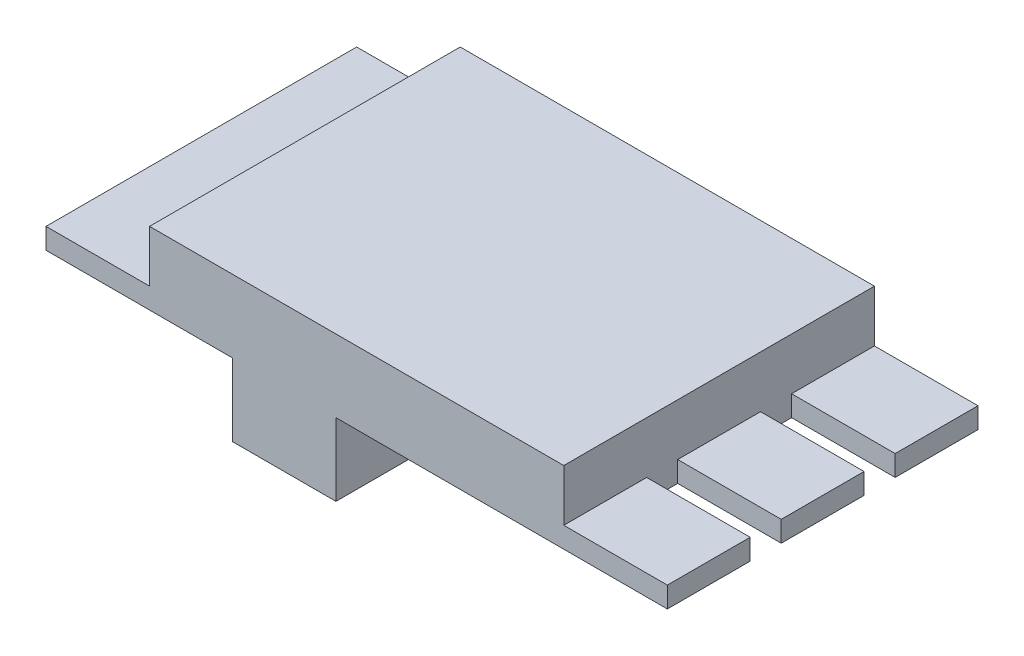
ISO-10303-21;
HEADER;
FILE_DESCRIPTION(('STEP AP214'),'2;1');
FILE_NAME('part.step','',(''),(''),'','','');
FILE_SCHEMA(('AUTOMOTIVE_DESIGN { 1 0 10303 214 1 1 1 1 }'));
ENDSEC;
DATA;
#1=APPLICATION_CONTEXT('core data for automotive mechanical design processes');
#2=APPLICATION_PROTOCOL_DEFINITION('international standard','automotive_design',2000,#1);
#3=PRODUCT_CONTEXT('',#1,'mechanical');
#4=PRODUCT('Part','Part','',(#3));
#5=PRODUCT_RELATED_PRODUCT_CATEGORY('part','',(#4));
#6=PRODUCT_DEFINITION_FORMATION('','',#4);
#7=PRODUCT_DEFINITION_CONTEXT('part definition',#1,'design');
#8=PRODUCT_DEFINITION('design','',#6,#7);
#9=PRODUCT_DEFINITION_SHAPE('','',#8);
#10=(LENGTH_UNIT() NAMED_UNIT(*) SI_UNIT(.MILLI.,.METRE.));
#11=(NAMED_UNIT(*) PLANE_ANGLE_UNIT() SI_UNIT($,.RADIAN.));
#12=(NAMED_UNIT(*) SI_UNIT($,.STERADIAN.) SOLID_ANGLE_UNIT());
#13=UNCERTAINTY_MEASURE_WITH_UNIT(LENGTH_MEASURE(1.E-05),#10,'distance_accuracy_value','');
#14=(GEOMETRIC_REPRESENTATION_CONTEXT(3) GLOBAL_UNCERTAINTY_ASSIGNED_CONTEXT((#13)) GLOBAL_UNIT_ASSIGNED_CONTEXT((#10,
#11,#12)) REPRESENTATION_CONTEXT('',''));
#15=CARTESIAN_POINT('',(0.,0.,0.));
#16=DIRECTION('',(0.,0.,1.));
#17=DIRECTION('',(1.,0.,0.));
#18=AXIS2_PLACEMENT_3D('',#15,#16,#17);
#19=CARTESIAN_POINT('',(15.,7.,7.5));
#20=DIRECTION('',(-1.,0.,0.));
#21=DIRECTION('',(0.,0.,1.));
#22=AXIS2_PLACEMENT_3D('',#19,#20,#21);
#23=PLANE('',#22);
#24=DIRECTION('',(0.,0.,1.));
#25=VECTOR('',#24,1.);
#26=CARTESIAN_POINT('',(15.,3.5,-11.));
#27=LINE('',#26,#25);
#28=CARTESIAN_POINT('',(15.,3.5,-2.));
#29=VERTEX_POINT('',#28);
#30=CARTESIAN_POINT('',(15.,3.5,2.));
#31=VERTEX_POINT('',#30);
#32=EDGE_CURVE('E191',#29,#31,#27,.T.);
#33=ORIENTED_EDGE('',*,*,#32,.F.);
#34=DIRECTION('',(0.,1.,0.));
#35=VECTOR('',#34,1.);
#36=CARTESIAN_POINT('',(15.,-11.5,-2.));
#37=LINE('',#36,#35);
#38=CARTESIAN_POINT('',(15.,4.5,-2.));
#39=VERTEX_POINT('',#38);
#40=EDGE_CURVE('E412',#29,#39,#37,.T.);
#41=ORIENTED_EDGE('',*,*,#40,.T.);
#42=DIRECTION('',(0.,0.,1.));
#43=VECTOR('',#42,1.);
#44=CARTESIAN_POINT('',(15.,4.5,-11.));
#45=LINE('',#44,#43);
#46=CARTESIAN_POINT('',(15.,4.5,2.));
#47=VERTEX_POINT('',#46);
#48=EDGE_CURVE('E193',#39,#47,#45,.T.);
#49=ORIENTED_EDGE('',*,*,#48,.T.);
#50=DIRECTION('',(0.,1.,0.));
#51=VECTOR('',#50,1.);
#52=CARTESIAN_POINT('',(15.,-11.5,2.));
#53=LINE('',#52,#51);
#54=EDGE_CURVE('E55',#31,#47,#53,.T.);
#55=ORIENTED_EDGE('',*,*,#54,.F.);
#56=EDGE_LOOP('',(#33,#41,#49,#55));
#57=FACE_BOUND('',#56,.T.);
#58=ADVANCED_FACE('F39',(#57),#23,.F.);
#59=CARTESIAN_POINT('',(15.,3.5,3.5));
#60=VERTEX_POINT('',#59);
#61=CARTESIAN_POINT('',(15.,3.5,7.5));
#62=VERTEX_POINT('',#61);
#63=EDGE_CURVE('E202',#60,#62,#27,.T.);
#64=ORIENTED_EDGE('',*,*,#63,.F.);
#65=DIRECTION('',(0.,1.,0.));
#66=VECTOR('',#65,1.);
#67=CARTESIAN_POINT('',(15.,-11.5,3.5));
#68=LINE('',#67,#66);
#69=CARTESIAN_POINT('',(15.,4.5,3.5));
#70=VERTEX_POINT('',#69);
#71=EDGE_CURVE('E396',#60,#70,#68,.T.);
#72=ORIENTED_EDGE('',*,*,#71,.T.);
#73=CARTESIAN_POINT('',(15.,4.5,7.5));
#74=VERTEX_POINT('',#73);
#75=EDGE_CURVE('E225',#70,#74,#45,.T.);
#76=ORIENTED_EDGE('',*,*,#75,.T.);
#77=DIRECTION('',(0.,-1.,0.));
#78=VECTOR('',#77,1.);
#79=CARTESIAN_POINT('',(15.,7.,7.5));
#80=LINE('',#79,#78);
#81=EDGE_CURVE('E296',#74,#62,#80,.T.);
#82=ORIENTED_EDGE('',*,*,#81,.T.);
#83=EDGE_LOOP('',(#64,#72,#76,#82));
#84=FACE_BOUND('',#83,.T.);
#85=ADVANCED_FACE('F395',(#84),#23,.F.);
#86=CARTESIAN_POINT('',(10.,4.5,-11.));
#87=DIRECTION('',(0.,-1.,0.));
#88=DIRECTION('',(0.,0.,-1.));
#89=AXIS2_PLACEMENT_3D('',#86,#87,#88);
#90=PLANE('',#89);
#91=ORIENTED_EDGE('',*,*,#48,.F.);
#92=DIRECTION('',(-1.,0.,0.));
#93=VECTOR('',#92,1.);
#94=CARTESIAN_POINT('',(10.,4.5,-2.));
#95=LINE('',#94,#93);
#96=CARTESIAN_POINT('',(10.,4.5,-2.));
#97=VERTEX_POINT('',#96);
#98=EDGE_CURVE('E426',#39,#97,#95,.T.);
#99=ORIENTED_EDGE('',*,*,#98,.T.);
#100=DIRECTION('',(0.,0.,1.));
#101=VECTOR('',#100,1.);
#102=CARTESIAN_POINT('',(10.,4.5,-11.));
#103=LINE('',#102,#101);
#104=CARTESIAN_POINT('',(10.,4.5,2.));
#105=VERTEX_POINT('',#104);
#106=EDGE_CURVE('E230',#97,#105,#103,.T.);
#107=ORIENTED_EDGE('',*,*,#106,.T.);
#108=DIRECTION('',(1.,0.,0.));
#109=VECTOR('',#108,1.);
#110=CARTESIAN_POINT('',(10.,4.5,2.));
#111=LINE('',#110,#109);
#112=EDGE_CURVE('E185',#105,#47,#111,.T.);
#113=ORIENTED_EDGE('',*,*,#112,.T.);
#114=EDGE_LOOP('',(#91,#99,#107,#113));
#115=FACE_BOUND('',#114,.T.);
#116=ADVANCED_FACE('F448',(#115),#90,.F.);
#117=ORIENTED_EDGE('',*,*,#75,.F.);
#118=DIRECTION('',(-1.,0.,0.));
#119=VECTOR('',#118,1.);
#120=CARTESIAN_POINT('',(10.,4.5,3.5));
#121=LINE('',#120,#119);
#122=CARTESIAN_POINT('',(10.,4.5,3.5));
#123=VERTEX_POINT('',#122);
#124=EDGE_CURVE('E184',#70,#123,#121,.T.);
#125=ORIENTED_EDGE('',*,*,#124,.T.);
#126=CARTESIAN_POINT('',(10.,4.5,7.5));
#127=VERTEX_POINT('',#126);
#128=EDGE_CURVE('E231',#123,#127,#103,.T.);
#129=ORIENTED_EDGE('',*,*,#128,.T.);
#130=DIRECTION('',(-1.,0.,0.));
#131=VECTOR('',#130,1.);
#132=CARTESIAN_POINT('',(-15.,4.5,7.5));
#133=LINE('',#132,#131);
#134=EDGE_CURVE('E48',#74,#127,#133,.T.);
#135=ORIENTED_EDGE('',*,*,#134,.F.);
#136=EDGE_LOOP('',(#117,#125,#129,#135));
#137=FACE_BOUND('',#136,.T.);
#138=ADVANCED_FACE('F348',(#137),#90,.F.);
#139=CARTESIAN_POINT('',(15.,4.5,-7.5));
#140=VERTEX_POINT('',#139);
#141=CARTESIAN_POINT('',(15.,4.5,-3.5));
#142=VERTEX_POINT('',#141);
#143=EDGE_CURVE('E221',#140,#142,#45,.T.);
#144=ORIENTED_EDGE('',*,*,#143,.T.);
#145=DIRECTION('',(0.,1.,0.));
#146=VECTOR('',#145,1.);
#147=CARTESIAN_POINT('',(15.,-11.5,-3.5));
#148=LINE('',#147,#146);
#149=CARTESIAN_POINT('',(15.,3.5,-3.5));
#150=VERTEX_POINT('',#149);
#151=EDGE_CURVE('E63',#150,#142,#148,.T.);
#152=ORIENTED_EDGE('',*,*,#151,.F.);
#153=CARTESIAN_POINT('',(15.,3.5,-7.5));
#154=VERTEX_POINT('',#153);
#155=EDGE_CURVE('E201',#154,#150,#27,.T.);
#156=ORIENTED_EDGE('',*,*,#155,.F.);
#157=DIRECTION('',(0.,-1.,0.));
#158=VECTOR('',#157,1.);
#159=CARTESIAN_POINT('',(15.,7.,-7.5));
#160=LINE('',#159,#158);
#161=EDGE_CURVE('E314',#140,#154,#160,.T.);
#162=ORIENTED_EDGE('',*,*,#161,.F.);
#163=EDGE_LOOP('',(#144,#152,#156,#162));
#164=FACE_BOUND('',#163,.T.);
#165=ADVANCED_FACE('F41',(#164),#23,.F.);
#166=CARTESIAN_POINT('',(-15.,7.,-7.5));
#167=DIRECTION('',(0.,0.,1.));
#168=DIRECTION('',(1.,0.,0.));
#169=AXIS2_PLACEMENT_3D('',#166,#167,#168);
#170=PLANE('',#169);
#171=DIRECTION('',(-1.,0.,0.));
#172=VECTOR('',#171,1.);
#173=CARTESIAN_POINT('',(-15.,0.,-7.5));
#174=LINE('',#173,#172);
#175=CARTESIAN_POINT('',(-1.,0.,-7.5));
#176=VERTEX_POINT('',#175);
#177=CARTESIAN_POINT('',(-6.,0.,-7.5));
#178=VERTEX_POINT('',#177);
#179=EDGE_CURVE('E286',#176,#178,#174,.T.);
#180=ORIENTED_EDGE('',*,*,#179,.T.);
#181=DIRECTION('',(0.,1.,0.));
#182=VECTOR('',#181,1.);
#183=CARTESIAN_POINT('',(-6.,7.,-7.5));
#184=LINE('',#183,#182);
#185=CARTESIAN_POINT('',(-6.,3.5,-7.5));
#186=VERTEX_POINT('',#185);
#187=EDGE_CURVE('E250',#178,#186,#184,.T.);
#188=ORIENTED_EDGE('',*,*,#187,.T.);
#189=DIRECTION('',(-1.,0.,0.));
#190=VECTOR('',#189,1.);
#191=CARTESIAN_POINT('',(-15.,3.5,-7.5));
#192=LINE('',#191,#190);
#193=CARTESIAN_POINT('',(-15.,3.5,-7.5));
#194=VERTEX_POINT('',#193);
#195=EDGE_CURVE('E282',#186,#194,#192,.T.);
#196=ORIENTED_EDGE('',*,*,#195,.T.);
#197=DIRECTION('',(0.,-1.,0.));
#198=VECTOR('',#197,1.);
#199=CARTESIAN_POINT('',(-15.,7.,-7.5));
#200=LINE('',#199,#198);
#201=CARTESIAN_POINT('',(-15.,4.5,-7.5));
#202=VERTEX_POINT('',#201);
#203=EDGE_CURVE('E310',#202,#194,#200,.T.);
#204=ORIENTED_EDGE('',*,*,#203,.F.);
#205=DIRECTION('',(1.,0.,0.));
#206=VECTOR('',#205,1.);
#207=CARTESIAN_POINT('',(-15.,4.5,-7.5));
#208=LINE('',#207,#206);
#209=CARTESIAN_POINT('',(-10.,4.5,-7.5));
#210=VERTEX_POINT('',#209);
#211=EDGE_CURVE('E270',#202,#210,#208,.T.);
#212=ORIENTED_EDGE('',*,*,#211,.T.);
#213=DIRECTION('',(0.,1.,0.));
#214=VECTOR('',#213,1.);
#215=CARTESIAN_POINT('',(-10.,7.,-7.5));
#216=LINE('',#215,#214);
#217=CARTESIAN_POINT('',(-10.,7.,-7.5));
#218=VERTEX_POINT('',#217);
#219=EDGE_CURVE('E258',#210,#218,#216,.T.);
#220=ORIENTED_EDGE('',*,*,#219,.T.);
#221=DIRECTION('',(-1.,0.,0.));
#222=VECTOR('',#221,1.);
#223=CARTESIAN_POINT('',(-15.,7.,-7.5));
#224=LINE('',#223,#222);
#225=CARTESIAN_POINT('',(10.,7.,-7.5));
#226=VERTEX_POINT('',#225);
#227=EDGE_CURVE('E287',#226,#218,#224,.T.);
#228=ORIENTED_EDGE('',*,*,#227,.F.);
#229=DIRECTION('',(0.,-1.,0.));
#230=VECTOR('',#229,1.);
#231=CARTESIAN_POINT('',(10.,7.,-7.5));
#232=LINE('',#231,#230);
#233=CARTESIAN_POINT('',(10.,4.5,-7.5));
#234=VERTEX_POINT('',#233);
#235=EDGE_CURVE('E266',#226,#234,#232,.T.);
#236=ORIENTED_EDGE('',*,*,#235,.T.);
#237=DIRECTION('',(1.,0.,0.));
#238=VECTOR('',#237,1.);
#239=CARTESIAN_POINT('',(-15.,4.5,-7.5));
#240=LINE('',#239,#238);
#241=EDGE_CURVE('E278',#234,#140,#240,.T.);
#242=ORIENTED_EDGE('',*,*,#241,.T.);
#243=ORIENTED_EDGE('',*,*,#161,.T.);
#244=DIRECTION('',(-1.,0.,0.));
#245=VECTOR('',#244,1.);
#246=CARTESIAN_POINT('',(-15.,3.5,-7.5));
#247=LINE('',#246,#245);
#248=CARTESIAN_POINT('',(-1.,3.5,-7.5));
#249=VERTEX_POINT('',#248);
#250=EDGE_CURVE('E274',#154,#249,#247,.T.);
#251=ORIENTED_EDGE('',*,*,#250,.T.);
#252=DIRECTION('',(0.,-1.,0.));
#253=VECTOR('',#252,1.);
#254=CARTESIAN_POINT('',(-1.,7.,-7.5));
#255=LINE('',#254,#253);
#256=EDGE_CURVE('E242',#249,#176,#255,.T.);
#257=ORIENTED_EDGE('',*,*,#256,.T.);
#258=EDGE_LOOP('',(#180,#188,#196,#204,#212,#220,#228,#236,#242,#243,#251,#257));
#259=FACE_BOUND('',#258,.T.);
#260=ADVANCED_FACE('F369',(#259),#170,.F.);
#261=CARTESIAN_POINT('',(-15.,7.,7.5));
#262=DIRECTION('',(1.,0.,0.));
#263=DIRECTION('',(0.,0.,-1.));
#264=AXIS2_PLACEMENT_3D('',#261,#262,#263);
#265=PLANE('',#264);
#266=ORIENTED_EDGE('',*,*,#203,.T.);
#267=DIRECTION('',(0.,0.,1.));
#268=VECTOR('',#267,1.);
#269=CARTESIAN_POINT('',(-15.,3.5,-11.));
#270=LINE('',#269,#268);
#271=CARTESIAN_POINT('',(-15.,3.5,7.5));
#272=VERTEX_POINT('',#271);
#273=EDGE_CURVE('E212',#194,#272,#270,.T.);
#274=ORIENTED_EDGE('',*,*,#273,.T.);
#275=DIRECTION('',(0.,-1.,0.));
#276=VECTOR('',#275,1.);
#277=CARTESIAN_POINT('',(-15.,7.,7.5));
#278=LINE('',#277,#276);
#279=CARTESIAN_POINT('',(-15.,4.5,7.5));
#280=VERTEX_POINT('',#279);
#281=EDGE_CURVE('E306',#280,#272,#278,.T.);
#282=ORIENTED_EDGE('',*,*,#281,.F.);
#283=DIRECTION('',(0.,0.,1.));
#284=VECTOR('',#283,1.);
#285=CARTESIAN_POINT('',(-15.,4.5,-11.));
#286=LINE('',#285,#284);
#287=EDGE_CURVE('E216',#202,#280,#286,.T.);
#288=ORIENTED_EDGE('',*,*,#287,.F.);
#289=EDGE_LOOP('',(#266,#274,#282,#288));
#290=FACE_BOUND('',#289,.T.);
#291=ADVANCED_FACE('F371',(#290),#265,.F.);
#292=CARTESIAN_POINT('',(-15.,7.,7.5));
#293=DIRECTION('',(0.,0.,-1.));
#294=DIRECTION('',(-1.,0.,0.));
#295=AXIS2_PLACEMENT_3D('',#292,#293,#294);
#296=PLANE('',#295);
#297=DIRECTION('',(1.,0.,0.));
#298=VECTOR('',#297,1.);
#299=CARTESIAN_POINT('',(-15.,3.5,7.5));
#300=LINE('',#299,#298);
#301=CARTESIAN_POINT('',(-6.,3.5,7.5));
#302=VERTEX_POINT('',#301);
#303=EDGE_CURVE('E11',#272,#302,#300,.T.);
#304=ORIENTED_EDGE('',*,*,#303,.T.);
#305=DIRECTION('',(0.,-1.,0.));
#306=VECTOR('',#305,1.);
#307=CARTESIAN_POINT('',(-6.,7.,7.5));
#308=LINE('',#307,#306);
#309=CARTESIAN_POINT('',(-6.,0.,7.5));
#310=VERTEX_POINT('',#309);
#311=EDGE_CURVE('E246',#302,#310,#308,.T.);
#312=ORIENTED_EDGE('',*,*,#311,.T.);
#313=DIRECTION('',(1.,0.,0.));
#314=VECTOR('',#313,1.);
#315=CARTESIAN_POINT('',(-15.,0.,7.5));
#316=LINE('',#315,#314);
#317=CARTESIAN_POINT('',(-1.,0.,7.5));
#318=VERTEX_POINT('',#317);
#319=EDGE_CURVE('E292',#310,#318,#316,.T.);
#320=ORIENTED_EDGE('',*,*,#319,.T.);
#321=DIRECTION('',(0.,1.,0.));
#322=VECTOR('',#321,1.);
#323=CARTESIAN_POINT('',(-1.,7.,7.5));
#324=LINE('',#323,#322);
#325=CARTESIAN_POINT('',(-1.,3.5,7.5));
#326=VERTEX_POINT('',#325);
#327=EDGE_CURVE('E236',#318,#326,#324,.T.);
#328=ORIENTED_EDGE('',*,*,#327,.T.);
#329=DIRECTION('',(1.,0.,0.));
#330=VECTOR('',#329,1.);
#331=CARTESIAN_POINT('',(-15.,3.5,7.5));
#332=LINE('',#331,#330);
#333=EDGE_CURVE('E335',#326,#62,#332,.T.);
#334=ORIENTED_EDGE('',*,*,#333,.T.);
#335=ORIENTED_EDGE('',*,*,#81,.F.);
#336=ORIENTED_EDGE('',*,*,#134,.T.);
#337=DIRECTION('',(0.,1.,0.));
#338=VECTOR('',#337,1.);
#339=CARTESIAN_POINT('',(10.,7.,7.5));
#340=LINE('',#339,#338);
#341=CARTESIAN_POINT('',(10.,7.,7.5));
#342=VERTEX_POINT('',#341);
#343=EDGE_CURVE('E262',#127,#342,#340,.T.);
#344=ORIENTED_EDGE('',*,*,#343,.T.);
#345=DIRECTION('',(1.,0.,0.));
#346=VECTOR('',#345,1.);
#347=CARTESIAN_POINT('',(-15.,7.,7.5));
#348=LINE('',#347,#346);
#349=CARTESIAN_POINT('',(-10.,7.,7.5));
#350=VERTEX_POINT('',#349);
#351=EDGE_CURVE('E291',#350,#342,#348,.T.);
#352=ORIENTED_EDGE('',*,*,#351,.F.);
#353=DIRECTION('',(0.,-1.,0.));
#354=VECTOR('',#353,1.);
#355=CARTESIAN_POINT('',(-10.,7.,7.5));
#356=LINE('',#355,#354);
#357=CARTESIAN_POINT('',(-10.,4.5,7.5));
#358=VERTEX_POINT('',#357);
#359=EDGE_CURVE('E254',#350,#358,#356,.T.);
#360=ORIENTED_EDGE('',*,*,#359,.T.);
#361=DIRECTION('',(-1.,0.,0.));
#362=VECTOR('',#361,1.);
#363=CARTESIAN_POINT('',(-15.,4.5,7.5));
#364=LINE('',#363,#362);
#365=EDGE_CURVE('E331',#358,#280,#364,.T.);
#366=ORIENTED_EDGE('',*,*,#365,.T.);
#367=ORIENTED_EDGE('',*,*,#281,.T.);
#368=EDGE_LOOP('',(#304,#312,#320,#328,#334,#335,#336,#344,#352,#360,#366,#367));
#369=FACE_BOUND('',#368,.T.);
#370=ADVANCED_FACE('F343',(#369),#296,.F.);
#371=CARTESIAN_POINT('',(0.,7.,0.));
#372=DIRECTION('',(0.,-1.,0.));
#373=DIRECTION('',(0.,0.,-1.));
#374=AXIS2_PLACEMENT_3D('',#371,#372,#373);
#375=PLANE('',#374);
#376=ORIENTED_EDGE('',*,*,#351,.T.);
#377=DIRECTION('',(0.,0.,-1.));
#378=VECTOR('',#377,1.);
#379=CARTESIAN_POINT('',(10.,7.,0.));
#380=LINE('',#379,#378);
#381=EDGE_CURVE('E328',#342,#226,#380,.T.);
#382=ORIENTED_EDGE('',*,*,#381,.T.);
#383=ORIENTED_EDGE('',*,*,#227,.T.);
#384=DIRECTION('',(0.,0.,1.));
#385=VECTOR('',#384,1.);
#386=CARTESIAN_POINT('',(-10.,7.,0.));
#387=LINE('',#386,#385);
#388=EDGE_CURVE('E324',#218,#350,#387,.T.);
#389=ORIENTED_EDGE('',*,*,#388,.T.);
#390=EDGE_LOOP('',(#376,#382,#383,#389));
#391=FACE_BOUND('',#390,.T.);
#392=ADVANCED_FACE('F359',(#391),#375,.F.);
#393=CARTESIAN_POINT('',(0.,0.,0.));
#394=DIRECTION('',(0.,-1.,0.));
#395=DIRECTION('',(0.,0.,-1.));
#396=AXIS2_PLACEMENT_3D('',#393,#394,#395);
#397=PLANE('',#396);
#398=DIRECTION('',(0.,0.,1.));
#399=VECTOR('',#398,1.);
#400=CARTESIAN_POINT('',(-6.,0.,0.));
#401=LINE('',#400,#399);
#402=EDGE_CURVE('E321',#178,#310,#401,.T.);
#403=ORIENTED_EDGE('',*,*,#402,.F.);
#404=ORIENTED_EDGE('',*,*,#179,.F.);
#405=DIRECTION('',(0.,0.,-1.));
#406=VECTOR('',#405,1.);
#407=CARTESIAN_POINT('',(-1.,0.,0.));
#408=LINE('',#407,#406);
#409=EDGE_CURVE('E318',#318,#176,#408,.T.);
#410=ORIENTED_EDGE('',*,*,#409,.F.);
#411=ORIENTED_EDGE('',*,*,#319,.F.);
#412=EDGE_LOOP('',(#403,#404,#410,#411));
#413=FACE_BOUND('',#412,.T.);
#414=ADVANCED_FACE('F382',(#413),#397,.T.);
#415=CARTESIAN_POINT('',(-1.,3.5,-11.));
#416=DIRECTION('',(0.,1.,0.));
#417=DIRECTION('',(0.,0.,1.));
#418=AXIS2_PLACEMENT_3D('',#415,#416,#417);
#419=PLANE('',#418);
#420=DIRECTION('',(0.,0.,1.));
#421=VECTOR('',#420,1.);
#422=CARTESIAN_POINT('',(10.,3.5,-11.));
#423=LINE('',#422,#421);
#424=CARTESIAN_POINT('',(10.,3.5,-3.5));
#425=VERTEX_POINT('',#424);
#426=CARTESIAN_POINT('',(10.,3.5,-2.));
#427=VERTEX_POINT('',#426);
#428=EDGE_CURVE('E208',#425,#427,#423,.T.);
#429=ORIENTED_EDGE('',*,*,#428,.T.);
#430=DIRECTION('',(1.,0.,0.));
#431=VECTOR('',#430,1.);
#432=CARTESIAN_POINT('',(-0.999999999999999,3.5,-2.));
#433=LINE('',#432,#431);
#434=EDGE_CURVE('E199',#427,#29,#433,.T.);
#435=ORIENTED_EDGE('',*,*,#434,.T.);
#436=ORIENTED_EDGE('',*,*,#32,.T.);
#437=DIRECTION('',(-1.,0.,0.));
#438=VECTOR('',#437,1.);
#439=CARTESIAN_POINT('',(-1.,3.5,2.));
#440=LINE('',#439,#438);
#441=CARTESIAN_POINT('',(10.,3.5,2.));
#442=VERTEX_POINT('',#441);
#443=EDGE_CURVE('E176',#31,#442,#440,.T.);
#444=ORIENTED_EDGE('',*,*,#443,.T.);
#445=DIRECTION('',(0.,0.,1.));
#446=VECTOR('',#445,1.);
#447=CARTESIAN_POINT('',(10.,3.5,-11.));
#448=LINE('',#447,#446);
#449=CARTESIAN_POINT('',(10.,3.5,3.5));
#450=VERTEX_POINT('',#449);
#451=EDGE_CURVE('E432',#442,#450,#448,.T.);
#452=ORIENTED_EDGE('',*,*,#451,.T.);
#453=DIRECTION('',(1.,0.,0.));
#454=VECTOR('',#453,1.);
#455=CARTESIAN_POINT('',(-1.,3.5,3.5));
#456=LINE('',#455,#454);
#457=EDGE_CURVE('E416',#450,#60,#456,.T.);
#458=ORIENTED_EDGE('',*,*,#457,.T.);
#459=ORIENTED_EDGE('',*,*,#63,.T.);
#460=ORIENTED_EDGE('',*,*,#333,.F.);
#461=DIRECTION('',(0.,0.,1.));
#462=VECTOR('',#461,1.);
#463=CARTESIAN_POINT('',(-1.,3.5,-11.));
#464=LINE('',#463,#462);
#465=EDGE_CURVE('E207',#249,#326,#464,.T.);
#466=ORIENTED_EDGE('',*,*,#465,.F.);
#467=ORIENTED_EDGE('',*,*,#250,.F.);
#468=ORIENTED_EDGE('',*,*,#155,.T.);
#469=DIRECTION('',(-1.,0.,0.));
#470=VECTOR('',#469,1.);
#471=CARTESIAN_POINT('',(-1.,3.5,-3.5));
#472=LINE('',#471,#470);
#473=EDGE_CURVE('E422',#150,#425,#472,.T.);
#474=ORIENTED_EDGE('',*,*,#473,.T.);
#475=EDGE_LOOP('',(#429,#435,#436,#444,#452,#458,#459,#460,#466,#467,#468,#474));
#476=FACE_BOUND('',#475,.T.);
#477=ADVANCED_FACE('F198',(#476),#419,.F.);
#478=CARTESIAN_POINT('',(-1.,0.,-11.));
#479=DIRECTION('',(-1.,0.,0.));
#480=DIRECTION('',(0.,0.,1.));
#481=AXIS2_PLACEMENT_3D('',#478,#479,#480);
#482=PLANE('',#481);
#483=ORIENTED_EDGE('',*,*,#465,.T.);
#484=ORIENTED_EDGE('',*,*,#327,.F.);
#485=ORIENTED_EDGE('',*,*,#409,.T.);
#486=ORIENTED_EDGE('',*,*,#256,.F.);
#487=EDGE_LOOP('',(#483,#484,#485,#486));
#488=FACE_BOUND('',#487,.T.);
#489=ADVANCED_FACE('F385',(#488),#482,.F.);
#490=CARTESIAN_POINT('',(-6.,3.5,-11.));
#491=DIRECTION('',(0.,1.,0.));
#492=DIRECTION('',(0.,0.,1.));
#493=AXIS2_PLACEMENT_3D('',#490,#491,#492);
#494=PLANE('',#493);
#495=DIRECTION('',(0.,0.,1.));
#496=VECTOR('',#495,1.);
#497=CARTESIAN_POINT('',(-6.,3.5,-11.));
#498=LINE('',#497,#496);
#499=EDGE_CURVE('E217',#186,#302,#498,.T.);
#500=ORIENTED_EDGE('',*,*,#499,.T.);
#501=ORIENTED_EDGE('',*,*,#303,.F.);
#502=ORIENTED_EDGE('',*,*,#273,.F.);
#503=ORIENTED_EDGE('',*,*,#195,.F.);
#504=EDGE_LOOP('',(#500,#501,#502,#503));
#505=FACE_BOUND('',#504,.T.);
#506=ADVANCED_FACE('F374',(#505),#494,.F.);
#507=CARTESIAN_POINT('',(-6.,3.5,-11.));
#508=DIRECTION('',(1.,0.,0.));
#509=DIRECTION('',(0.,0.,-1.));
#510=AXIS2_PLACEMENT_3D('',#507,#508,#509);
#511=PLANE('',#510);
#512=ORIENTED_EDGE('',*,*,#402,.T.);
#513=ORIENTED_EDGE('',*,*,#311,.F.);
#514=ORIENTED_EDGE('',*,*,#499,.F.);
#515=ORIENTED_EDGE('',*,*,#187,.F.);
#516=EDGE_LOOP('',(#512,#513,#514,#515));
#517=FACE_BOUND('',#516,.T.);
#518=ADVANCED_FACE('F377',(#517),#511,.F.);
#519=CARTESIAN_POINT('',(-10.,4.5,-11.));
#520=DIRECTION('',(0.,-1.,0.));
#521=DIRECTION('',(0.,0.,-1.));
#522=AXIS2_PLACEMENT_3D('',#519,#520,#521);
#523=PLANE('',#522);
#524=ORIENTED_EDGE('',*,*,#287,.T.);
#525=ORIENTED_EDGE('',*,*,#365,.F.);
#526=DIRECTION('',(0.,0.,1.));
#527=VECTOR('',#526,1.);
#528=CARTESIAN_POINT('',(-10.,4.5,-11.));
#529=LINE('',#528,#527);
#530=EDGE_CURVE('E232',#210,#358,#529,.T.);
#531=ORIENTED_EDGE('',*,*,#530,.F.);
#532=ORIENTED_EDGE('',*,*,#211,.F.);
#533=EDGE_LOOP('',(#524,#525,#531,#532));
#534=FACE_BOUND('',#533,.T.);
#535=ADVANCED_FACE('F365',(#534),#523,.F.);
#536=CARTESIAN_POINT('',(-10.,4.5,-11.));
#537=DIRECTION('',(1.,0.,0.));
#538=DIRECTION('',(0.,0.,-1.));
#539=AXIS2_PLACEMENT_3D('',#536,#537,#538);
#540=PLANE('',#539);
#541=ORIENTED_EDGE('',*,*,#530,.T.);
#542=ORIENTED_EDGE('',*,*,#359,.F.);
#543=ORIENTED_EDGE('',*,*,#388,.F.);
#544=ORIENTED_EDGE('',*,*,#219,.F.);
#545=EDGE_LOOP('',(#541,#542,#543,#544));
#546=FACE_BOUND('',#545,.T.);
#547=ADVANCED_FACE('F362',(#546),#540,.F.);
#548=CARTESIAN_POINT('',(10.,4.5,-3.5));
#549=VERTEX_POINT('',#548);
#550=EDGE_CURVE('E226',#234,#549,#103,.T.);
#551=ORIENTED_EDGE('',*,*,#550,.T.);
#552=DIRECTION('',(1.,0.,0.));
#553=VECTOR('',#552,1.);
#554=CARTESIAN_POINT('',(10.,4.5,-3.5));
#555=LINE('',#554,#553);
#556=EDGE_CURVE('E419',#549,#142,#555,.T.);
#557=ORIENTED_EDGE('',*,*,#556,.T.);
#558=ORIENTED_EDGE('',*,*,#143,.F.);
#559=ORIENTED_EDGE('',*,*,#241,.F.);
#560=EDGE_LOOP('',(#551,#557,#558,#559));
#561=FACE_BOUND('',#560,.T.);
#562=ADVANCED_FACE('F458',(#561),#90,.F.);
#563=CARTESIAN_POINT('',(10.,4.5,-11.));
#564=DIRECTION('',(-1.,0.,0.));
#565=DIRECTION('',(0.,0.,1.));
#566=AXIS2_PLACEMENT_3D('',#563,#564,#565);
#567=PLANE('',#566);
#568=ORIENTED_EDGE('',*,*,#235,.F.);
#569=ORIENTED_EDGE('',*,*,#381,.F.);
#570=ORIENTED_EDGE('',*,*,#343,.F.);
#571=ORIENTED_EDGE('',*,*,#128,.F.);
#572=DIRECTION('',(0.,1.,0.));
#573=VECTOR('',#572,1.);
#574=CARTESIAN_POINT('',(10.,-11.5,3.5));
#575=LINE('',#574,#573);
#576=EDGE_CURVE('E400',#450,#123,#575,.T.);
#577=ORIENTED_EDGE('',*,*,#576,.F.);
#578=ORIENTED_EDGE('',*,*,#451,.F.);
#579=DIRECTION('',(0.,1.,0.));
#580=VECTOR('',#579,1.);
#581=CARTESIAN_POINT('',(10.,-11.5,2.));
#582=LINE('',#581,#580);
#583=EDGE_CURVE('E179',#442,#105,#582,.T.);
#584=ORIENTED_EDGE('',*,*,#583,.T.);
#585=ORIENTED_EDGE('',*,*,#106,.F.);
#586=DIRECTION('',(0.,1.,0.));
#587=VECTOR('',#586,1.);
#588=CARTESIAN_POINT('',(10.,-11.5,-2.));
#589=LINE('',#588,#587);
#590=EDGE_CURVE('E439',#427,#97,#589,.T.);
#591=ORIENTED_EDGE('',*,*,#590,.F.);
#592=ORIENTED_EDGE('',*,*,#428,.F.);
#593=DIRECTION('',(0.,1.,0.));
#594=VECTOR('',#593,1.);
#595=CARTESIAN_POINT('',(10.,-11.5,-3.5));
#596=LINE('',#595,#594);
#597=EDGE_CURVE('E404',#425,#549,#596,.T.);
#598=ORIENTED_EDGE('',*,*,#597,.T.);
#599=ORIENTED_EDGE('',*,*,#550,.F.);
#600=EDGE_LOOP('',(#568,#569,#570,#571,#577,#578,#584,#585,#591,#592,#598,#599));
#601=FACE_BOUND('',#600,.T.);
#602=ADVANCED_FACE('F355',(#601),#567,.F.);
#603=CARTESIAN_POINT('',(15.,-11.5,3.5));
#604=DIRECTION('',(0.,0.,1.));
#605=DIRECTION('',(1.,0.,0.));
#606=AXIS2_PLACEMENT_3D('',#603,#604,#605);
#607=PLANE('',#606);
#608=ORIENTED_EDGE('',*,*,#576,.T.);
#609=ORIENTED_EDGE('',*,*,#124,.F.);
#610=ORIENTED_EDGE('',*,*,#71,.F.);
#611=ORIENTED_EDGE('',*,*,#457,.F.);
#612=EDGE_LOOP('',(#608,#609,#610,#611));
#613=FACE_BOUND('',#612,.T.);
#614=ADVANCED_FACE('F449',(#613),#607,.F.);
#615=CARTESIAN_POINT('',(15.,-11.5,2.));
#616=DIRECTION('',(0.,0.,-1.));
#617=DIRECTION('',(-1.,0.,0.));
#618=AXIS2_PLACEMENT_3D('',#615,#616,#617);
#619=PLANE('',#618);
#620=ORIENTED_EDGE('',*,*,#54,.T.);
#621=ORIENTED_EDGE('',*,*,#112,.F.);
#622=ORIENTED_EDGE('',*,*,#583,.F.);
#623=ORIENTED_EDGE('',*,*,#443,.F.);
#624=EDGE_LOOP('',(#620,#621,#622,#623));
#625=FACE_BOUND('',#624,.T.);
#626=ADVANCED_FACE('F177',(#625),#619,.F.);
#627=CARTESIAN_POINT('',(15.,-11.5,-2.));
#628=DIRECTION('',(0.,0.,1.));
#629=DIRECTION('',(1.,0.,0.));
#630=AXIS2_PLACEMENT_3D('',#627,#628,#629);
#631=PLANE('',#630);
#632=ORIENTED_EDGE('',*,*,#590,.T.);
#633=ORIENTED_EDGE('',*,*,#98,.F.);
#634=ORIENTED_EDGE('',*,*,#40,.F.);
#635=ORIENTED_EDGE('',*,*,#434,.F.);
#636=EDGE_LOOP('',(#632,#633,#634,#635));
#637=FACE_BOUND('',#636,.T.);
#638=ADVANCED_FACE('F456',(#637),#631,.F.);
#639=CARTESIAN_POINT('',(15.,-11.5,-3.5));
#640=DIRECTION('',(0.,0.,-1.));
#641=DIRECTION('',(-1.,0.,0.));
#642=AXIS2_PLACEMENT_3D('',#639,#640,#641);
#643=PLANE('',#642);
#644=ORIENTED_EDGE('',*,*,#151,.T.);
#645=ORIENTED_EDGE('',*,*,#556,.F.);
#646=ORIENTED_EDGE('',*,*,#597,.F.);
#647=ORIENTED_EDGE('',*,*,#473,.F.);
#648=EDGE_LOOP('',(#644,#645,#646,#647));
#649=FACE_BOUND('',#648,.T.);
#650=ADVANCED_FACE('F440',(#649),#643,.F.);
#651=CLOSED_SHELL('',(#58,#85,#116,#138,#165,#260,#291,#370,#392,#414,#477,#489,#506,#518,#535,
#547,#562,#602,#614,#626,#638,#650));
#652=MANIFOLD_SOLID_BREP('B2',#651);
#653=ADVANCED_BREP_SHAPE_REPRESENTATION('',(#18,#652),#14);
#654=SHAPE_DEFINITION_REPRESENTATION(#9,#653);
ENDSEC;
END-ISO-10303-21;
